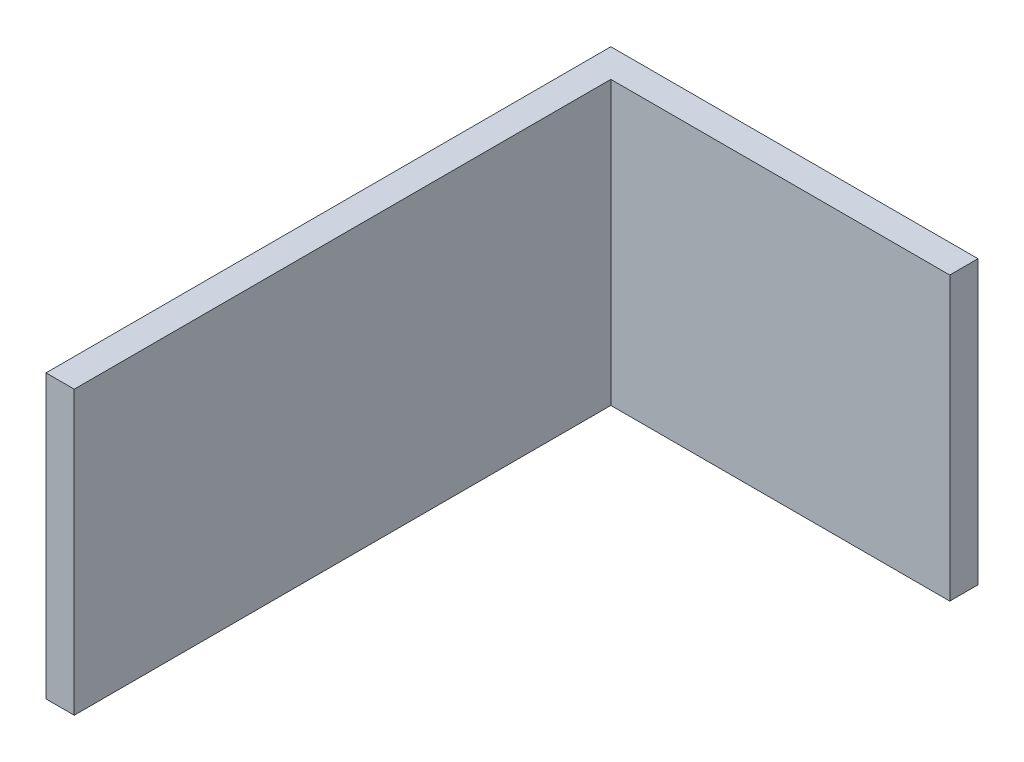
ISO-10303-21;
HEADER;
FILE_DESCRIPTION(('STEP AP214'),'2;1');
FILE_NAME('part.step','',(''),(''),'','','');
FILE_SCHEMA(('AUTOMOTIVE_DESIGN { 1 0 10303 214 1 1 1 1 }'));
ENDSEC;
DATA;
#1=APPLICATION_CONTEXT('core data for automotive mechanical design processes');
#2=APPLICATION_PROTOCOL_DEFINITION('international standard','automotive_design',2000,#1);
#3=PRODUCT_CONTEXT('',#1,'mechanical');
#4=PRODUCT('Part','Part','',(#3));
#5=PRODUCT_RELATED_PRODUCT_CATEGORY('part','',(#4));
#6=PRODUCT_DEFINITION_FORMATION('','',#4);
#7=PRODUCT_DEFINITION_CONTEXT('part definition',#1,'design');
#8=PRODUCT_DEFINITION('design','',#6,#7);
#9=PRODUCT_DEFINITION_SHAPE('','',#8);
#10=(LENGTH_UNIT() NAMED_UNIT(*) SI_UNIT(.MILLI.,.METRE.));
#11=(NAMED_UNIT(*) PLANE_ANGLE_UNIT() SI_UNIT($,.RADIAN.));
#12=(NAMED_UNIT(*) SI_UNIT($,.STERADIAN.) SOLID_ANGLE_UNIT());
#13=UNCERTAINTY_MEASURE_WITH_UNIT(LENGTH_MEASURE(1.E-05),#10,'distance_accuracy_value','');
#14=(GEOMETRIC_REPRESENTATION_CONTEXT(3) GLOBAL_UNCERTAINTY_ASSIGNED_CONTEXT((#13)) GLOBAL_UNIT_ASSIGNED_CONTEXT((#10,
#11,#12)) REPRESENTATION_CONTEXT('',''));
#15=CARTESIAN_POINT('',(0.,0.,0.));
#16=DIRECTION('',(0.,0.,1.));
#17=DIRECTION('',(1.,0.,0.));
#18=AXIS2_PLACEMENT_3D('',#15,#16,#17);
#19=CARTESIAN_POINT('',(500.,0.,10000.));
#20=DIRECTION('',(-1.,0.,0.));
#21=DIRECTION('',(0.,0.,1.));
#22=AXIS2_PLACEMENT_3D('',#19,#20,#21);
#23=PLANE('',#22);
#24=DIRECTION('',(0.,-1.,0.));
#25=VECTOR('',#24,1.);
#26=CARTESIAN_POINT('',(500.,0.,500.));
#27=LINE('',#26,#25);
#28=CARTESIAN_POINT('',(500.,5000.,500.));
#29=VERTEX_POINT('',#28);
#30=CARTESIAN_POINT('',(500.,0.,500.));
#31=VERTEX_POINT('',#30);
#32=EDGE_CURVE('E50',#29,#31,#27,.T.);
#33=ORIENTED_EDGE('',*,*,#32,.F.);
#34=DIRECTION('',(0.,0.,-1.));
#35=VECTOR('',#34,1.);
#36=CARTESIAN_POINT('',(500.,5000.,10000.));
#37=LINE('',#36,#35);
#38=CARTESIAN_POINT('',(500.,5000.,10000.));
#39=VERTEX_POINT('',#38);
#40=EDGE_CURVE('E136',#39,#29,#37,.T.);
#41=ORIENTED_EDGE('',*,*,#40,.F.);
#42=DIRECTION('',(0.,1.,0.));
#43=VECTOR('',#42,1.);
#44=CARTESIAN_POINT('',(500.,0.,10000.));
#45=LINE('',#44,#43);
#46=CARTESIAN_POINT('',(500.,0.,10000.));
#47=VERTEX_POINT('',#46);
#48=EDGE_CURVE('E129',#47,#39,#45,.T.);
#49=ORIENTED_EDGE('',*,*,#48,.F.);
#50=DIRECTION('',(0.,0.,-1.));
#51=VECTOR('',#50,1.);
#52=CARTESIAN_POINT('',(500.,0.,10000.));
#53=LINE('',#52,#51);
#54=EDGE_CURVE('E43',#47,#31,#53,.T.);
#55=ORIENTED_EDGE('',*,*,#54,.T.);
#56=EDGE_LOOP('',(#33,#41,#49,#55));
#57=FACE_BOUND('',#56,.T.);
#58=ADVANCED_FACE('F35',(#57),#23,.F.);
#59=CARTESIAN_POINT('',(0.,0.,10000.));
#60=DIRECTION('',(1.,0.,0.));
#61=DIRECTION('',(0.,0.,-1.));
#62=AXIS2_PLACEMENT_3D('',#59,#60,#61);
#63=PLANE('',#62);
#64=DIRECTION('',(0.,-1.,0.));
#65=VECTOR('',#64,1.);
#66=CARTESIAN_POINT('',(0.,0.,0.));
#67=LINE('',#66,#65);
#68=CARTESIAN_POINT('',(0.,5000.,0.));
#69=VERTEX_POINT('',#68);
#70=CARTESIAN_POINT('',(0.,0.,0.));
#71=VERTEX_POINT('',#70);
#72=EDGE_CURVE('E101',#69,#71,#67,.T.);
#73=ORIENTED_EDGE('',*,*,#72,.T.);
#74=DIRECTION('',(0.,0.,-1.));
#75=VECTOR('',#74,1.);
#76=CARTESIAN_POINT('',(0.,0.,10000.));
#77=LINE('',#76,#75);
#78=CARTESIAN_POINT('',(0.,0.,10000.));
#79=VERTEX_POINT('',#78);
#80=EDGE_CURVE('E11',#79,#71,#77,.T.);
#81=ORIENTED_EDGE('',*,*,#80,.F.);
#82=DIRECTION('',(0.,-1.,0.));
#83=VECTOR('',#82,1.);
#84=CARTESIAN_POINT('',(0.,0.,10000.));
#85=LINE('',#84,#83);
#86=CARTESIAN_POINT('',(0.,5000.,10000.));
#87=VERTEX_POINT('',#86);
#88=EDGE_CURVE('E102',#87,#79,#85,.T.);
#89=ORIENTED_EDGE('',*,*,#88,.F.);
#90=DIRECTION('',(0.,0.,-1.));
#91=VECTOR('',#90,1.);
#92=CARTESIAN_POINT('',(0.,5000.,10000.));
#93=LINE('',#92,#91);
#94=EDGE_CURVE('E132',#87,#69,#93,.T.);
#95=ORIENTED_EDGE('',*,*,#94,.T.);
#96=EDGE_LOOP('',(#73,#81,#89,#95));
#97=FACE_BOUND('',#96,.T.);
#98=ADVANCED_FACE('F37',(#97),#63,.F.);
#99=CARTESIAN_POINT('',(0.,0.,10000.));
#100=DIRECTION('',(0.,1.,0.));
#101=DIRECTION('',(0.,0.,1.));
#102=AXIS2_PLACEMENT_3D('',#99,#100,#101);
#103=PLANE('',#102);
#104=DIRECTION('',(1.,0.,0.));
#105=VECTOR('',#104,1.);
#106=CARTESIAN_POINT('',(0.,0.,0.));
#107=LINE('',#106,#105);
#108=CARTESIAN_POINT('',(6500.,0.,0.));
#109=VERTEX_POINT('',#108);
#110=EDGE_CURVE('E103',#71,#109,#107,.T.);
#111=ORIENTED_EDGE('',*,*,#110,.T.);
#112=DIRECTION('',(0.,0.,-1.));
#113=VECTOR('',#112,1.);
#114=CARTESIAN_POINT('',(6500.,0.,0.));
#115=LINE('',#114,#113);
#116=CARTESIAN_POINT('',(6500.,0.,500.));
#117=VERTEX_POINT('',#116);
#118=EDGE_CURVE('E117',#117,#109,#115,.T.);
#119=ORIENTED_EDGE('',*,*,#118,.F.);
#120=DIRECTION('',(-1.,0.,0.));
#121=VECTOR('',#120,1.);
#122=CARTESIAN_POINT('',(6500.,0.,500.));
#123=LINE('',#122,#121);
#124=EDGE_CURVE('E122',#117,#31,#123,.T.);
#125=ORIENTED_EDGE('',*,*,#124,.T.);
#126=ORIENTED_EDGE('',*,*,#54,.F.);
#127=DIRECTION('',(1.,0.,0.));
#128=VECTOR('',#127,1.);
#129=CARTESIAN_POINT('',(0.,0.,10000.));
#130=LINE('',#129,#128);
#131=EDGE_CURVE('E81',#79,#47,#130,.T.);
#132=ORIENTED_EDGE('',*,*,#131,.F.);
#133=ORIENTED_EDGE('',*,*,#80,.T.);
#134=EDGE_LOOP('',(#111,#119,#125,#126,#132,#133));
#135=FACE_BOUND('',#134,.T.);
#136=ADVANCED_FACE('F141',(#135),#103,.F.);
#137=CARTESIAN_POINT('',(0.,5000.,10000.));
#138=DIRECTION('',(0.,-1.,0.));
#139=DIRECTION('',(0.,0.,-1.));
#140=AXIS2_PLACEMENT_3D('',#137,#138,#139);
#141=PLANE('',#140);
#142=DIRECTION('',(-1.,0.,0.));
#143=VECTOR('',#142,1.);
#144=CARTESIAN_POINT('',(0.,5000.,0.));
#145=LINE('',#144,#143);
#146=CARTESIAN_POINT('',(6500.,5000.,3.36468379447228E-13));
#147=VERTEX_POINT('',#146);
#148=EDGE_CURVE('E74',#147,#69,#145,.T.);
#149=ORIENTED_EDGE('',*,*,#148,.T.);
#150=ORIENTED_EDGE('',*,*,#94,.F.);
#151=DIRECTION('',(-1.,0.,0.));
#152=VECTOR('',#151,1.);
#153=CARTESIAN_POINT('',(0.,5000.,10000.));
#154=LINE('',#153,#152);
#155=EDGE_CURVE('E59',#39,#87,#154,.T.);
#156=ORIENTED_EDGE('',*,*,#155,.F.);
#157=ORIENTED_EDGE('',*,*,#40,.T.);
#158=DIRECTION('',(-1.,0.,0.));
#159=VECTOR('',#158,1.);
#160=CARTESIAN_POINT('',(6500.,5000.,500.));
#161=LINE('',#160,#159);
#162=CARTESIAN_POINT('',(6500.,5000.,500.));
#163=VERTEX_POINT('',#162);
#164=EDGE_CURVE('E109',#163,#29,#161,.T.);
#165=ORIENTED_EDGE('',*,*,#164,.F.);
#166=DIRECTION('',(0.,0.,1.));
#167=VECTOR('',#166,1.);
#168=CARTESIAN_POINT('',(6500.,5000.,3.36468379447228E-13));
#169=LINE('',#168,#167);
#170=EDGE_CURVE('E106',#147,#163,#169,.T.);
#171=ORIENTED_EDGE('',*,*,#170,.F.);
#172=EDGE_LOOP('',(#149,#150,#156,#157,#165,#171));
#173=FACE_BOUND('',#172,.T.);
#174=ADVANCED_FACE('F107',(#173),#141,.F.);
#175=CARTESIAN_POINT('',(0.,0.,10000.));
#176=DIRECTION('',(0.,0.,-1.));
#177=DIRECTION('',(-1.,0.,0.));
#178=AXIS2_PLACEMENT_3D('',#175,#176,#177);
#179=PLANE('',#178);
#180=ORIENTED_EDGE('',*,*,#88,.T.);
#181=ORIENTED_EDGE('',*,*,#131,.T.);
#182=ORIENTED_EDGE('',*,*,#48,.T.);
#183=ORIENTED_EDGE('',*,*,#155,.T.);
#184=EDGE_LOOP('',(#180,#181,#182,#183));
#185=FACE_BOUND('',#184,.T.);
#186=ADVANCED_FACE('F145',(#185),#179,.F.);
#187=CARTESIAN_POINT('',(0.,0.,0.));
#188=DIRECTION('',(0.,0.,-1.));
#189=DIRECTION('',(-1.,0.,0.));
#190=AXIS2_PLACEMENT_3D('',#187,#188,#189);
#191=PLANE('',#190);
#192=ORIENTED_EDGE('',*,*,#72,.F.);
#193=ORIENTED_EDGE('',*,*,#148,.F.);
#194=DIRECTION('',(0.,1.,0.));
#195=VECTOR('',#194,1.);
#196=CARTESIAN_POINT('',(6500.,0.,0.));
#197=LINE('',#196,#195);
#198=EDGE_CURVE('E99',#109,#147,#197,.T.);
#199=ORIENTED_EDGE('',*,*,#198,.F.);
#200=ORIENTED_EDGE('',*,*,#110,.F.);
#201=EDGE_LOOP('',(#192,#193,#199,#200));
#202=FACE_BOUND('',#201,.T.);
#203=ADVANCED_FACE('F97',(#202),#191,.T.);
#204=CARTESIAN_POINT('',(6500.,0.,500.));
#205=DIRECTION('',(0.,0.,-1.));
#206=DIRECTION('',(-1.,0.,0.));
#207=AXIS2_PLACEMENT_3D('',#204,#205,#206);
#208=PLANE('',#207);
#209=ORIENTED_EDGE('',*,*,#32,.T.);
#210=ORIENTED_EDGE('',*,*,#124,.F.);
#211=DIRECTION('',(0.,-1.,0.));
#212=VECTOR('',#211,1.);
#213=CARTESIAN_POINT('',(6500.,0.,500.));
#214=LINE('',#213,#212);
#215=EDGE_CURVE('E112',#163,#117,#214,.T.);
#216=ORIENTED_EDGE('',*,*,#215,.F.);
#217=ORIENTED_EDGE('',*,*,#164,.T.);
#218=EDGE_LOOP('',(#209,#210,#216,#217));
#219=FACE_BOUND('',#218,.T.);
#220=ADVANCED_FACE('F140',(#219),#208,.F.);
#221=CARTESIAN_POINT('',(6500.,0.,0.));
#222=DIRECTION('',(1.,0.,0.));
#223=DIRECTION('',(0.,0.,-1.));
#224=AXIS2_PLACEMENT_3D('',#221,#222,#223);
#225=PLANE('',#224);
#226=ORIENTED_EDGE('',*,*,#198,.T.);
#227=ORIENTED_EDGE('',*,*,#170,.T.);
#228=ORIENTED_EDGE('',*,*,#215,.T.);
#229=ORIENTED_EDGE('',*,*,#118,.T.);
#230=EDGE_LOOP('',(#226,#227,#228,#229));
#231=FACE_BOUND('',#230,.T.);
#232=ADVANCED_FACE('F115',(#231),#225,.T.);
#233=CLOSED_SHELL('',(#58,#98,#136,#174,#186,#203,#220,#232));
#234=MANIFOLD_SOLID_BREP('B2',#233);
#235=ADVANCED_BREP_SHAPE_REPRESENTATION('',(#18,#234),#14);
#236=SHAPE_DEFINITION_REPRESENTATION(#9,#235);
ENDSEC;
END-ISO-10303-21;
